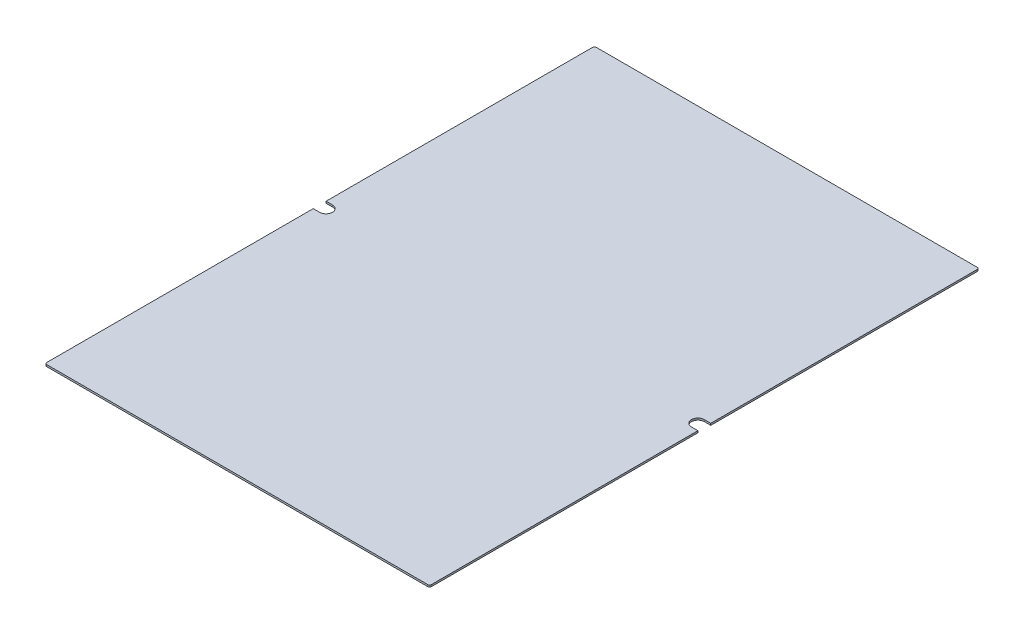
ISO-10303-21;
HEADER;
FILE_DESCRIPTION(('STEP AP214'),'2;1');
FILE_NAME('part.step','',(''),(''),'','','');
FILE_SCHEMA(('AUTOMOTIVE_DESIGN { 1 0 10303 214 1 1 1 1 }'));
ENDSEC;
DATA;
#1=APPLICATION_CONTEXT('core data for automotive mechanical design processes');
#2=APPLICATION_PROTOCOL_DEFINITION('international standard','automotive_design',2000,#1);
#3=PRODUCT_CONTEXT('',#1,'mechanical');
#4=PRODUCT('Part','Part','',(#3));
#5=PRODUCT_RELATED_PRODUCT_CATEGORY('part','',(#4));
#6=PRODUCT_DEFINITION_FORMATION('','',#4);
#7=PRODUCT_DEFINITION_CONTEXT('part definition',#1,'design');
#8=PRODUCT_DEFINITION('design','',#6,#7);
#9=PRODUCT_DEFINITION_SHAPE('','',#8);
#10=(LENGTH_UNIT() NAMED_UNIT(*) SI_UNIT(.MILLI.,.METRE.));
#11=(NAMED_UNIT(*) PLANE_ANGLE_UNIT() SI_UNIT($,.RADIAN.));
#12=(NAMED_UNIT(*) SI_UNIT($,.STERADIAN.) SOLID_ANGLE_UNIT());
#13=UNCERTAINTY_MEASURE_WITH_UNIT(LENGTH_MEASURE(1.E-05),#10,'distance_accuracy_value','');
#14=(GEOMETRIC_REPRESENTATION_CONTEXT(3) GLOBAL_UNCERTAINTY_ASSIGNED_CONTEXT((#13)) GLOBAL_UNIT_ASSIGNED_CONTEXT((#10,
#11,#12)) REPRESENTATION_CONTEXT('',''));
#15=CARTESIAN_POINT('',(0.,0.,0.));
#16=DIRECTION('',(0.,0.,1.));
#17=DIRECTION('',(1.,0.,0.));
#18=AXIS2_PLACEMENT_3D('',#15,#16,#17);
#19=CARTESIAN_POINT('',(0.,1.,0.));
#20=DIRECTION('',(1.,0.,0.));
#21=DIRECTION('',(0.,0.,-1.));
#22=AXIS2_PLACEMENT_3D('',#19,#20,#21);
#23=PLANE('',#22);
#24=DIRECTION('',(0.,0.,1.));
#25=VECTOR('',#24,1.);
#26=CARTESIAN_POINT('',(0.,0.,0.));
#27=LINE('',#26,#25);
#28=CARTESIAN_POINT('',(0.,0.,-146.5));
#29=VERTEX_POINT('',#28);
#30=CARTESIAN_POINT('',(0.,0.,-1.));
#31=VERTEX_POINT('',#30);
#32=EDGE_CURVE('E195',#29,#31,#27,.T.);
#33=ORIENTED_EDGE('',*,*,#32,.T.);
#34=DIRECTION('',(0.,-1.,0.));
#35=VECTOR('',#34,1.);
#36=CARTESIAN_POINT('',(0.,1.,-1.));
#37=LINE('',#36,#35);
#38=CARTESIAN_POINT('',(0.,1.,-1.));
#39=VERTEX_POINT('',#38);
#40=EDGE_CURVE('E252',#31,#39,#37,.F.);
#41=ORIENTED_EDGE('',*,*,#40,.T.);
#42=DIRECTION('',(0.,0.,1.));
#43=VECTOR('',#42,1.);
#44=CARTESIAN_POINT('',(0.,1.,0.));
#45=LINE('',#44,#43);
#46=CARTESIAN_POINT('',(0.,1.,-146.5));
#47=VERTEX_POINT('',#46);
#48=EDGE_CURVE('E221',#47,#39,#45,.T.);
#49=ORIENTED_EDGE('',*,*,#48,.F.);
#50=DIRECTION('',(0.,-1.,0.));
#51=VECTOR('',#50,1.);
#52=CARTESIAN_POINT('',(0.,1.,-146.5));
#53=LINE('',#52,#51);
#54=EDGE_CURVE('E194',#47,#29,#53,.T.);
#55=ORIENTED_EDGE('',*,*,#54,.T.);
#56=EDGE_LOOP('',(#33,#41,#49,#55));
#57=FACE_BOUND('',#56,.T.);
#58=ADVANCED_FACE('F33',(#57),#23,.F.);
#59=CARTESIAN_POINT('',(0.,1.,0.));
#60=DIRECTION('',(0.,0.,-1.));
#61=DIRECTION('',(-1.,0.,0.));
#62=AXIS2_PLACEMENT_3D('',#59,#60,#61);
#63=PLANE('',#62);
#64=DIRECTION('',(1.,0.,0.));
#65=VECTOR('',#64,1.);
#66=CARTESIAN_POINT('',(0.,1.,0.));
#67=LINE('',#66,#65);
#68=CARTESIAN_POINT('',(1.,1.,0.));
#69=VERTEX_POINT('',#68);
#70=CARTESIAN_POINT('',(209.,1.,0.));
#71=VERTEX_POINT('',#70);
#72=EDGE_CURVE('E159',#69,#71,#67,.T.);
#73=ORIENTED_EDGE('',*,*,#72,.F.);
#74=DIRECTION('',(0.,-1.,0.));
#75=VECTOR('',#74,1.);
#76=CARTESIAN_POINT('',(1.,1.,0.));
#77=LINE('',#76,#75);
#78=CARTESIAN_POINT('',(1.,0.,0.));
#79=VERTEX_POINT('',#78);
#80=EDGE_CURVE('E241',#69,#79,#77,.T.);
#81=ORIENTED_EDGE('',*,*,#80,.T.);
#82=DIRECTION('',(1.,0.,0.));
#83=VECTOR('',#82,1.);
#84=CARTESIAN_POINT('',(0.,0.,0.));
#85=LINE('',#84,#83);
#86=CARTESIAN_POINT('',(209.,0.,0.));
#87=VERTEX_POINT('',#86);
#88=EDGE_CURVE('E198',#79,#87,#85,.T.);
#89=ORIENTED_EDGE('',*,*,#88,.T.);
#90=DIRECTION('',(0.,-1.,0.));
#91=VECTOR('',#90,1.);
#92=CARTESIAN_POINT('',(209.,1.,0.));
#93=LINE('',#92,#91);
#94=EDGE_CURVE('E168',#87,#71,#93,.F.);
#95=ORIENTED_EDGE('',*,*,#94,.T.);
#96=EDGE_LOOP('',(#73,#81,#89,#95));
#97=FACE_BOUND('',#96,.T.);
#98=ADVANCED_FACE('F312',(#97),#63,.F.);
#99=CARTESIAN_POINT('',(210.,1.,0.));
#100=DIRECTION('',(-1.,0.,0.));
#101=DIRECTION('',(0.,0.,1.));
#102=AXIS2_PLACEMENT_3D('',#99,#100,#101);
#103=PLANE('',#102);
#104=DIRECTION('',(0.,0.,-1.));
#105=VECTOR('',#104,1.);
#106=CARTESIAN_POINT('',(210.,1.,0.));
#107=LINE('',#106,#105);
#108=CARTESIAN_POINT('',(210.,1.,-1.));
#109=VERTEX_POINT('',#108);
#110=CARTESIAN_POINT('',(210.,1.,-146.5));
#111=VERTEX_POINT('',#110);
#112=EDGE_CURVE('E146',#109,#111,#107,.T.);
#113=ORIENTED_EDGE('',*,*,#112,.F.);
#114=DIRECTION('',(0.,-1.,0.));
#115=VECTOR('',#114,1.);
#116=CARTESIAN_POINT('',(210.,1.,-1.));
#117=LINE('',#116,#115);
#118=CARTESIAN_POINT('',(210.,0.,-1.));
#119=VERTEX_POINT('',#118);
#120=EDGE_CURVE('E260',#109,#119,#117,.T.);
#121=ORIENTED_EDGE('',*,*,#120,.T.);
#122=DIRECTION('',(0.,0.,-1.));
#123=VECTOR('',#122,1.);
#124=CARTESIAN_POINT('',(210.,0.,0.));
#125=LINE('',#124,#123);
#126=CARTESIAN_POINT('',(210.,0.,-146.5));
#127=VERTEX_POINT('',#126);
#128=EDGE_CURVE('E165',#119,#127,#125,.T.);
#129=ORIENTED_EDGE('',*,*,#128,.T.);
#130=DIRECTION('',(0.,-1.,0.));
#131=VECTOR('',#130,1.);
#132=CARTESIAN_POINT('',(210.,1.,-146.5));
#133=LINE('',#132,#131);
#134=EDGE_CURVE('E162',#111,#127,#133,.T.);
#135=ORIENTED_EDGE('',*,*,#134,.F.);
#136=EDGE_LOOP('',(#113,#121,#129,#135));
#137=FACE_BOUND('',#136,.T.);
#138=ADVANCED_FACE('F163',(#137),#103,.F.);
#139=CARTESIAN_POINT('',(206.5,1.,-146.5));
#140=DIRECTION('',(0.,0.,1.));
#141=DIRECTION('',(1.,0.,0.));
#142=AXIS2_PLACEMENT_3D('',#139,#140,#141);
#143=PLANE('',#142);
#144=DIRECTION('',(-1.,0.,0.));
#145=VECTOR('',#144,1.);
#146=CARTESIAN_POINT('',(206.5,0.,-146.5));
#147=LINE('',#146,#145);
#148=CARTESIAN_POINT('',(206.5,0.,-146.5));
#149=VERTEX_POINT('',#148);
#150=EDGE_CURVE('E202',#127,#149,#147,.T.);
#151=ORIENTED_EDGE('',*,*,#150,.T.);
#152=DIRECTION('',(0.,-1.,0.));
#153=VECTOR('',#152,1.);
#154=CARTESIAN_POINT('',(206.5,1.,-146.5));
#155=LINE('',#154,#153);
#156=CARTESIAN_POINT('',(206.5,1.,-146.5));
#157=VERTEX_POINT('',#156);
#158=EDGE_CURVE('E169',#157,#149,#155,.T.);
#159=ORIENTED_EDGE('',*,*,#158,.F.);
#160=DIRECTION('',(-1.,0.,0.));
#161=VECTOR('',#160,1.);
#162=CARTESIAN_POINT('',(206.5,1.,-146.5));
#163=LINE('',#162,#161);
#164=EDGE_CURVE('E151',#111,#157,#163,.T.);
#165=ORIENTED_EDGE('',*,*,#164,.F.);
#166=ORIENTED_EDGE('',*,*,#134,.T.);
#167=EDGE_LOOP('',(#151,#159,#165,#166));
#168=FACE_BOUND('',#167,.T.);
#169=ADVANCED_FACE('F171',(#168),#143,.F.);
#170=CARTESIAN_POINT('',(206.5,1.,-150.));
#171=DIRECTION('',(0.,-1.,0.));
#172=DIRECTION('',(0.,0.,-1.));
#173=AXIS2_PLACEMENT_3D('',#170,#171,#172);
#174=CYLINDRICAL_SURFACE('',#173,3.5);
#175=CARTESIAN_POINT('',(206.5,0.,-150.));
#176=DIRECTION('',(0.,-1.,0.));
#177=DIRECTION('',(0.,0.,-1.));
#178=AXIS2_PLACEMENT_3D('',#175,#176,#177);
#179=CIRCLE('',#178,3.5);
#180=CARTESIAN_POINT('',(206.5,0.,-153.5));
#181=VERTEX_POINT('',#180);
#182=EDGE_CURVE('E204',#149,#181,#179,.T.);
#183=ORIENTED_EDGE('',*,*,#182,.T.);
#184=DIRECTION('',(0.,-1.,0.));
#185=VECTOR('',#184,1.);
#186=CARTESIAN_POINT('',(206.5,1.,-153.5));
#187=LINE('',#186,#185);
#188=CARTESIAN_POINT('',(206.5,1.,-153.5));
#189=VERTEX_POINT('',#188);
#190=EDGE_CURVE('E236',#189,#181,#187,.T.);
#191=ORIENTED_EDGE('',*,*,#190,.F.);
#192=CARTESIAN_POINT('',(206.5,1.,-150.));
#193=DIRECTION('',(0.,-1.,0.));
#194=DIRECTION('',(0.,0.,-1.));
#195=AXIS2_PLACEMENT_3D('',#192,#193,#194);
#196=CIRCLE('',#195,3.5);
#197=EDGE_CURVE('E174',#157,#189,#196,.T.);
#198=ORIENTED_EDGE('',*,*,#197,.F.);
#199=ORIENTED_EDGE('',*,*,#158,.T.);
#200=EDGE_LOOP('',(#183,#191,#198,#199));
#201=FACE_BOUND('',#200,.T.);
#202=ADVANCED_FACE('F335',(#201),#174,.F.);
#203=CARTESIAN_POINT('',(206.5,1.,-153.5));
#204=DIRECTION('',(0.,0.,-1.));
#205=DIRECTION('',(-1.,0.,0.));
#206=AXIS2_PLACEMENT_3D('',#203,#204,#205);
#207=PLANE('',#206);
#208=DIRECTION('',(1.,0.,0.));
#209=VECTOR('',#208,1.);
#210=CARTESIAN_POINT('',(206.5,0.,-153.5));
#211=LINE('',#210,#209);
#212=CARTESIAN_POINT('',(210.,0.,-153.5));
#213=VERTEX_POINT('',#212);
#214=EDGE_CURVE('E206',#181,#213,#211,.T.);
#215=ORIENTED_EDGE('',*,*,#214,.T.);
#216=DIRECTION('',(0.,-1.,0.));
#217=VECTOR('',#216,1.);
#218=CARTESIAN_POINT('',(210.,1.,-153.5));
#219=LINE('',#218,#217);
#220=CARTESIAN_POINT('',(210.,1.,-153.5));
#221=VERTEX_POINT('',#220);
#222=EDGE_CURVE('E233',#221,#213,#219,.T.);
#223=ORIENTED_EDGE('',*,*,#222,.F.);
#224=DIRECTION('',(1.,0.,0.));
#225=VECTOR('',#224,1.);
#226=CARTESIAN_POINT('',(206.5,1.,-153.5));
#227=LINE('',#226,#225);
#228=EDGE_CURVE('E176',#189,#221,#227,.T.);
#229=ORIENTED_EDGE('',*,*,#228,.F.);
#230=ORIENTED_EDGE('',*,*,#190,.T.);
#231=EDGE_LOOP('',(#215,#223,#229,#230));
#232=FACE_BOUND('',#231,.T.);
#233=ADVANCED_FACE('F338',(#232),#207,.F.);
#234=CARTESIAN_POINT('',(210.,1.,-153.5));
#235=DIRECTION('',(-1.,0.,0.));
#236=DIRECTION('',(0.,0.,1.));
#237=AXIS2_PLACEMENT_3D('',#234,#235,#236);
#238=PLANE('',#237);
#239=DIRECTION('',(0.,0.,-1.));
#240=VECTOR('',#239,1.);
#241=CARTESIAN_POINT('',(210.,0.,-153.5));
#242=LINE('',#241,#240);
#243=CARTESIAN_POINT('',(210.,0.,-299.));
#244=VERTEX_POINT('',#243);
#245=EDGE_CURVE('E208',#213,#244,#242,.T.);
#246=ORIENTED_EDGE('',*,*,#245,.T.);
#247=DIRECTION('',(0.,-1.,0.));
#248=VECTOR('',#247,1.);
#249=CARTESIAN_POINT('',(210.,1.,-299.));
#250=LINE('',#249,#248);
#251=CARTESIAN_POINT('',(210.,1.,-299.));
#252=VERTEX_POINT('',#251);
#253=EDGE_CURVE('E41',#244,#252,#250,.F.);
#254=ORIENTED_EDGE('',*,*,#253,.T.);
#255=DIRECTION('',(0.,0.,-1.));
#256=VECTOR('',#255,1.);
#257=CARTESIAN_POINT('',(210.,1.,-153.5));
#258=LINE('',#257,#256);
#259=EDGE_CURVE('E181',#221,#252,#258,.T.);
#260=ORIENTED_EDGE('',*,*,#259,.F.);
#261=ORIENTED_EDGE('',*,*,#222,.T.);
#262=EDGE_LOOP('',(#246,#254,#260,#261));
#263=FACE_BOUND('',#262,.T.);
#264=ADVANCED_FACE('F268',(#263),#238,.F.);
#265=CARTESIAN_POINT('',(0.,1.,-300.));
#266=DIRECTION('',(0.,0.,1.));
#267=DIRECTION('',(1.,0.,0.));
#268=AXIS2_PLACEMENT_3D('',#265,#266,#267);
#269=PLANE('',#268);
#270=DIRECTION('',(-1.,0.,0.));
#271=VECTOR('',#270,1.);
#272=CARTESIAN_POINT('',(0.,1.,-300.));
#273=LINE('',#272,#271);
#274=CARTESIAN_POINT('',(209.,1.,-300.));
#275=VERTEX_POINT('',#274);
#276=CARTESIAN_POINT('',(1.,1.,-300.));
#277=VERTEX_POINT('',#276);
#278=EDGE_CURVE('E184',#275,#277,#273,.T.);
#279=ORIENTED_EDGE('',*,*,#278,.F.);
#280=DIRECTION('',(0.,-1.,0.));
#281=VECTOR('',#280,1.);
#282=CARTESIAN_POINT('',(209.,1.,-300.));
#283=LINE('',#282,#281);
#284=CARTESIAN_POINT('',(209.,0.,-300.));
#285=VERTEX_POINT('',#284);
#286=EDGE_CURVE('E263',#275,#285,#283,.T.);
#287=ORIENTED_EDGE('',*,*,#286,.T.);
#288=DIRECTION('',(-1.,0.,0.));
#289=VECTOR('',#288,1.);
#290=CARTESIAN_POINT('',(0.,0.,-300.));
#291=LINE('',#290,#289);
#292=CARTESIAN_POINT('',(1.,0.,-300.));
#293=VERTEX_POINT('',#292);
#294=EDGE_CURVE('E211',#285,#293,#291,.T.);
#295=ORIENTED_EDGE('',*,*,#294,.T.);
#296=DIRECTION('',(0.,-1.,0.));
#297=VECTOR('',#296,1.);
#298=CARTESIAN_POINT('',(1.,1.,-300.));
#299=LINE('',#298,#297);
#300=EDGE_CURVE('E56',#293,#277,#299,.F.);
#301=ORIENTED_EDGE('',*,*,#300,.T.);
#302=EDGE_LOOP('',(#279,#287,#295,#301));
#303=FACE_BOUND('',#302,.T.);
#304=ADVANCED_FACE('F277',(#303),#269,.F.);
#305=CARTESIAN_POINT('',(0.,1.,-153.5));
#306=DIRECTION('',(1.,0.,0.));
#307=DIRECTION('',(0.,0.,-1.));
#308=AXIS2_PLACEMENT_3D('',#305,#306,#307);
#309=PLANE('',#308);
#310=DIRECTION('',(0.,0.,1.));
#311=VECTOR('',#310,1.);
#312=CARTESIAN_POINT('',(0.,1.,-153.5));
#313=LINE('',#312,#311);
#314=CARTESIAN_POINT('',(0.,1.,-299.));
#315=VERTEX_POINT('',#314);
#316=CARTESIAN_POINT('',(0.,1.,-153.5));
#317=VERTEX_POINT('',#316);
#318=EDGE_CURVE('E186',#315,#317,#313,.T.);
#319=ORIENTED_EDGE('',*,*,#318,.F.);
#320=DIRECTION('',(0.,-1.,0.));
#321=VECTOR('',#320,1.);
#322=CARTESIAN_POINT('',(0.,1.,-299.));
#323=LINE('',#322,#321);
#324=CARTESIAN_POINT('',(0.,0.,-299.));
#325=VERTEX_POINT('',#324);
#326=EDGE_CURVE('E11',#315,#325,#323,.T.);
#327=ORIENTED_EDGE('',*,*,#326,.T.);
#328=DIRECTION('',(0.,0.,1.));
#329=VECTOR('',#328,1.);
#330=CARTESIAN_POINT('',(0.,0.,-153.5));
#331=LINE('',#330,#329);
#332=CARTESIAN_POINT('',(0.,0.,-153.5));
#333=VERTEX_POINT('',#332);
#334=EDGE_CURVE('E213',#325,#333,#331,.T.);
#335=ORIENTED_EDGE('',*,*,#334,.T.);
#336=DIRECTION('',(0.,-1.,0.));
#337=VECTOR('',#336,1.);
#338=CARTESIAN_POINT('',(0.,1.,-153.5));
#339=LINE('',#338,#337);
#340=EDGE_CURVE('E230',#317,#333,#339,.T.);
#341=ORIENTED_EDGE('',*,*,#340,.F.);
#342=EDGE_LOOP('',(#319,#327,#335,#341));
#343=FACE_BOUND('',#342,.T.);
#344=ADVANCED_FACE('F286',(#343),#309,.F.);
#345=CARTESIAN_POINT('',(3.5,1.,-153.5));
#346=DIRECTION('',(0.,0.,-1.));
#347=DIRECTION('',(-1.,0.,0.));
#348=AXIS2_PLACEMENT_3D('',#345,#346,#347);
#349=PLANE('',#348);
#350=DIRECTION('',(1.,0.,0.));
#351=VECTOR('',#350,1.);
#352=CARTESIAN_POINT('',(3.5,0.,-153.5));
#353=LINE('',#352,#351);
#354=CARTESIAN_POINT('',(3.5,0.,-153.5));
#355=VERTEX_POINT('',#354);
#356=EDGE_CURVE('E215',#333,#355,#353,.T.);
#357=ORIENTED_EDGE('',*,*,#356,.T.);
#358=DIRECTION('',(0.,-1.,0.));
#359=VECTOR('',#358,1.);
#360=CARTESIAN_POINT('',(3.5,1.,-153.5));
#361=LINE('',#360,#359);
#362=CARTESIAN_POINT('',(3.5,1.,-153.5));
#363=VERTEX_POINT('',#362);
#364=EDGE_CURVE('E227',#363,#355,#361,.T.);
#365=ORIENTED_EDGE('',*,*,#364,.F.);
#366=DIRECTION('',(1.,0.,0.));
#367=VECTOR('',#366,1.);
#368=CARTESIAN_POINT('',(3.5,1.,-153.5));
#369=LINE('',#368,#367);
#370=EDGE_CURVE('E188',#317,#363,#369,.T.);
#371=ORIENTED_EDGE('',*,*,#370,.F.);
#372=ORIENTED_EDGE('',*,*,#340,.T.);
#373=EDGE_LOOP('',(#357,#365,#371,#372));
#374=FACE_BOUND('',#373,.T.);
#375=ADVANCED_FACE('F293',(#374),#349,.F.);
#376=CARTESIAN_POINT('',(3.5,1.,-150.));
#377=DIRECTION('',(0.,-1.,0.));
#378=DIRECTION('',(0.,0.,-1.));
#379=AXIS2_PLACEMENT_3D('',#376,#377,#378);
#380=CYLINDRICAL_SURFACE('',#379,3.5);
#381=CARTESIAN_POINT('',(3.5,0.,-150.));
#382=DIRECTION('',(0.,-1.,0.));
#383=DIRECTION('',(0.,0.,1.));
#384=AXIS2_PLACEMENT_3D('',#381,#382,#383);
#385=CIRCLE('',#384,3.5);
#386=CARTESIAN_POINT('',(3.5,0.,-146.5));
#387=VERTEX_POINT('',#386);
#388=EDGE_CURVE('E217',#355,#387,#385,.T.);
#389=ORIENTED_EDGE('',*,*,#388,.T.);
#390=DIRECTION('',(0.,-1.,0.));
#391=VECTOR('',#390,1.);
#392=CARTESIAN_POINT('',(3.5,1.,-146.5));
#393=LINE('',#392,#391);
#394=CARTESIAN_POINT('',(3.5,1.,-146.5));
#395=VERTEX_POINT('',#394);
#396=EDGE_CURVE('E224',#395,#387,#393,.T.);
#397=ORIENTED_EDGE('',*,*,#396,.F.);
#398=CARTESIAN_POINT('',(3.5,1.,-150.));
#399=DIRECTION('',(0.,-1.,0.));
#400=DIRECTION('',(0.,0.,1.));
#401=AXIS2_PLACEMENT_3D('',#398,#399,#400);
#402=CIRCLE('',#401,3.5);
#403=EDGE_CURVE('E190',#363,#395,#402,.T.);
#404=ORIENTED_EDGE('',*,*,#403,.F.);
#405=ORIENTED_EDGE('',*,*,#364,.T.);
#406=EDGE_LOOP('',(#389,#397,#404,#405));
#407=FACE_BOUND('',#406,.T.);
#408=ADVANCED_FACE('F296',(#407),#380,.F.);
#409=CARTESIAN_POINT('',(3.5,1.,-146.5));
#410=DIRECTION('',(0.,0.,1.));
#411=DIRECTION('',(1.,0.,0.));
#412=AXIS2_PLACEMENT_3D('',#409,#410,#411);
#413=PLANE('',#412);
#414=DIRECTION('',(-1.,0.,0.));
#415=VECTOR('',#414,1.);
#416=CARTESIAN_POINT('',(3.5,0.,-146.5));
#417=LINE('',#416,#415);
#418=EDGE_CURVE('E219',#387,#29,#417,.T.);
#419=ORIENTED_EDGE('',*,*,#418,.T.);
#420=ORIENTED_EDGE('',*,*,#54,.F.);
#421=DIRECTION('',(-1.,0.,0.));
#422=VECTOR('',#421,1.);
#423=CARTESIAN_POINT('',(3.5,1.,-146.5));
#424=LINE('',#423,#422);
#425=EDGE_CURVE('E192',#395,#47,#424,.T.);
#426=ORIENTED_EDGE('',*,*,#425,.F.);
#427=ORIENTED_EDGE('',*,*,#396,.T.);
#428=EDGE_LOOP('',(#419,#420,#426,#427));
#429=FACE_BOUND('',#428,.T.);
#430=ADVANCED_FACE('F301',(#429),#413,.F.);
#431=CARTESIAN_POINT('',(3.5,1.,-150.));
#432=DIRECTION('',(0.,1.,0.));
#433=DIRECTION('',(0.,0.,1.));
#434=AXIS2_PLACEMENT_3D('',#431,#432,#433);
#435=PLANE('',#434);
#436=ORIENTED_EDGE('',*,*,#48,.T.);
#437=CARTESIAN_POINT('',(1.,1.,-1.));
#438=DIRECTION('',(0.,1.,0.));
#439=DIRECTION('',(0.,0.,1.));
#440=AXIS2_PLACEMENT_3D('',#437,#438,#439);
#441=CIRCLE('',#440,1.);
#442=EDGE_CURVE('E258',#39,#69,#441,.T.);
#443=ORIENTED_EDGE('',*,*,#442,.T.);
#444=ORIENTED_EDGE('',*,*,#72,.T.);
#445=CARTESIAN_POINT('',(209.,1.,-1.));
#446=DIRECTION('',(0.,1.,0.));
#447=DIRECTION('',(0.,0.,1.));
#448=AXIS2_PLACEMENT_3D('',#445,#446,#447);
#449=CIRCLE('',#448,1.);
#450=EDGE_CURVE('E155',#71,#109,#449,.T.);
#451=ORIENTED_EDGE('',*,*,#450,.T.);
#452=ORIENTED_EDGE('',*,*,#112,.T.);
#453=ORIENTED_EDGE('',*,*,#164,.T.);
#454=ORIENTED_EDGE('',*,*,#197,.T.);
#455=ORIENTED_EDGE('',*,*,#228,.T.);
#456=ORIENTED_EDGE('',*,*,#259,.T.);
#457=CARTESIAN_POINT('',(209.,1.,-299.));
#458=DIRECTION('',(0.,1.,0.));
#459=DIRECTION('',(0.,0.,1.));
#460=AXIS2_PLACEMENT_3D('',#457,#458,#459);
#461=CIRCLE('',#460,1.);
#462=EDGE_CURVE('E255',#252,#275,#461,.T.);
#463=ORIENTED_EDGE('',*,*,#462,.T.);
#464=ORIENTED_EDGE('',*,*,#278,.T.);
#465=CARTESIAN_POINT('',(1.,1.,-299.));
#466=DIRECTION('',(0.,1.,0.));
#467=DIRECTION('',(0.,0.,1.));
#468=AXIS2_PLACEMENT_3D('',#465,#466,#467);
#469=CIRCLE('',#468,1.);
#470=EDGE_CURVE('E48',#277,#315,#469,.T.);
#471=ORIENTED_EDGE('',*,*,#470,.T.);
#472=ORIENTED_EDGE('',*,*,#318,.T.);
#473=ORIENTED_EDGE('',*,*,#370,.T.);
#474=ORIENTED_EDGE('',*,*,#403,.T.);
#475=ORIENTED_EDGE('',*,*,#425,.T.);
#476=EDGE_LOOP('',(#436,#443,#444,#451,#452,#453,#454,#455,#456,#463,#464,#471,#472,#473,#474,#475));
#477=FACE_BOUND('',#476,.T.);
#478=ADVANCED_FACE('F149',(#477),#435,.T.);
#479=CARTESIAN_POINT('',(3.5,0.,-150.));
#480=DIRECTION('',(0.,1.,0.));
#481=DIRECTION('',(0.,0.,1.));
#482=AXIS2_PLACEMENT_3D('',#479,#480,#481);
#483=PLANE('',#482);
#484=ORIENTED_EDGE('',*,*,#88,.F.);
#485=CARTESIAN_POINT('',(1.,0.,-1.));
#486=DIRECTION('',(0.,1.,0.));
#487=DIRECTION('',(0.,0.,1.));
#488=AXIS2_PLACEMENT_3D('',#485,#486,#487);
#489=CIRCLE('',#488,1.);
#490=EDGE_CURVE('E250',#79,#31,#489,.F.);
#491=ORIENTED_EDGE('',*,*,#490,.T.);
#492=ORIENTED_EDGE('',*,*,#32,.F.);
#493=ORIENTED_EDGE('',*,*,#418,.F.);
#494=ORIENTED_EDGE('',*,*,#388,.F.);
#495=ORIENTED_EDGE('',*,*,#356,.F.);
#496=ORIENTED_EDGE('',*,*,#334,.F.);
#497=CARTESIAN_POINT('',(1.,0.,-299.));
#498=DIRECTION('',(0.,1.,0.));
#499=DIRECTION('',(0.,0.,1.));
#500=AXIS2_PLACEMENT_3D('',#497,#498,#499);
#501=CIRCLE('',#500,1.);
#502=EDGE_CURVE('E244',#325,#293,#501,.F.);
#503=ORIENTED_EDGE('',*,*,#502,.T.);
#504=ORIENTED_EDGE('',*,*,#294,.F.);
#505=CARTESIAN_POINT('',(209.,0.,-299.));
#506=DIRECTION('',(0.,1.,0.));
#507=DIRECTION('',(0.,0.,1.));
#508=AXIS2_PLACEMENT_3D('',#505,#506,#507);
#509=CIRCLE('',#508,1.);
#510=EDGE_CURVE('E246',#285,#244,#509,.F.);
#511=ORIENTED_EDGE('',*,*,#510,.T.);
#512=ORIENTED_EDGE('',*,*,#245,.F.);
#513=ORIENTED_EDGE('',*,*,#214,.F.);
#514=ORIENTED_EDGE('',*,*,#182,.F.);
#515=ORIENTED_EDGE('',*,*,#150,.F.);
#516=ORIENTED_EDGE('',*,*,#128,.F.);
#517=CARTESIAN_POINT('',(209.,0.,-1.));
#518=DIRECTION('',(0.,1.,0.));
#519=DIRECTION('',(0.,0.,1.));
#520=AXIS2_PLACEMENT_3D('',#517,#518,#519);
#521=CIRCLE('',#520,1.);
#522=EDGE_CURVE('E248',#119,#87,#521,.F.);
#523=ORIENTED_EDGE('',*,*,#522,.T.);
#524=EDGE_LOOP('',(#484,#491,#492,#493,#494,#495,#496,#503,#504,#511,#512,#513,#514,#515,#516,#523));
#525=FACE_BOUND('',#524,.T.);
#526=ADVANCED_FACE('F280',(#525),#483,.F.);
#527=CARTESIAN_POINT('',(1.,1.,-1.));
#528=DIRECTION('',(0.,-1.,0.));
#529=DIRECTION('',(0.,0.,-1.));
#530=AXIS2_PLACEMENT_3D('',#527,#528,#529);
#531=CYLINDRICAL_SURFACE('',#530,1.);
#532=ORIENTED_EDGE('',*,*,#442,.F.);
#533=ORIENTED_EDGE('',*,*,#40,.F.);
#534=ORIENTED_EDGE('',*,*,#490,.F.);
#535=ORIENTED_EDGE('',*,*,#80,.F.);
#536=EDGE_LOOP('',(#532,#533,#534,#535));
#537=FACE_BOUND('',#536,.T.);
#538=ADVANCED_FACE('F310',(#537),#531,.T.);
#539=CARTESIAN_POINT('',(209.,1.,-1.));
#540=DIRECTION('',(0.,-1.,0.));
#541=DIRECTION('',(0.,0.,-1.));
#542=AXIS2_PLACEMENT_3D('',#539,#540,#541);
#543=CYLINDRICAL_SURFACE('',#542,1.);
#544=ORIENTED_EDGE('',*,*,#450,.F.);
#545=ORIENTED_EDGE('',*,*,#94,.F.);
#546=ORIENTED_EDGE('',*,*,#522,.F.);
#547=ORIENTED_EDGE('',*,*,#120,.F.);
#548=EDGE_LOOP('',(#544,#545,#546,#547));
#549=FACE_BOUND('',#548,.T.);
#550=ADVANCED_FACE('F316',(#549),#543,.T.);
#551=CARTESIAN_POINT('',(209.,1.,-299.));
#552=DIRECTION('',(0.,-1.,0.));
#553=DIRECTION('',(0.,0.,-1.));
#554=AXIS2_PLACEMENT_3D('',#551,#552,#553);
#555=CYLINDRICAL_SURFACE('',#554,1.);
#556=ORIENTED_EDGE('',*,*,#462,.F.);
#557=ORIENTED_EDGE('',*,*,#253,.F.);
#558=ORIENTED_EDGE('',*,*,#510,.F.);
#559=ORIENTED_EDGE('',*,*,#286,.F.);
#560=EDGE_LOOP('',(#556,#557,#558,#559));
#561=FACE_BOUND('',#560,.T.);
#562=ADVANCED_FACE('F275',(#561),#555,.T.);
#563=CARTESIAN_POINT('',(1.,1.,-299.));
#564=DIRECTION('',(0.,-1.,0.));
#565=DIRECTION('',(0.,0.,-1.));
#566=AXIS2_PLACEMENT_3D('',#563,#564,#565);
#567=CYLINDRICAL_SURFACE('',#566,1.);
#568=ORIENTED_EDGE('',*,*,#470,.F.);
#569=ORIENTED_EDGE('',*,*,#300,.F.);
#570=ORIENTED_EDGE('',*,*,#502,.F.);
#571=ORIENTED_EDGE('',*,*,#326,.F.);
#572=EDGE_LOOP('',(#568,#569,#570,#571));
#573=FACE_BOUND('',#572,.T.);
#574=ADVANCED_FACE('F35',(#573),#567,.T.);
#575=CLOSED_SHELL('',(#58,#98,#138,#169,#202,#233,#264,#304,#344,#375,#408,#430,#478,#526,#538,
#550,#562,#574));
#576=MANIFOLD_SOLID_BREP('B2',#575);
#577=ADVANCED_BREP_SHAPE_REPRESENTATION('',(#18,#576),#14);
#578=SHAPE_DEFINITION_REPRESENTATION(#9,#577);
ENDSEC;
END-ISO-10303-21;
